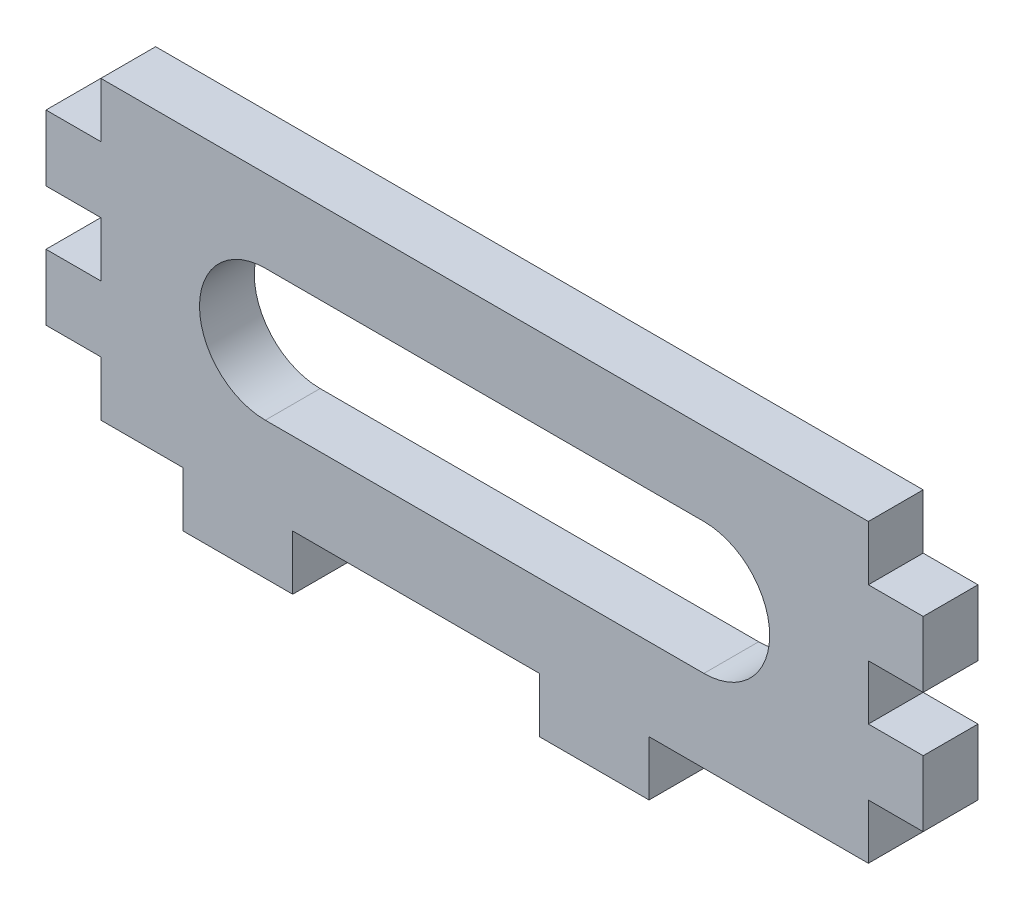
ISO-10303-21;
HEADER;
FILE_DESCRIPTION(('STEP AP214'),'2;1');
FILE_NAME('part.step','',(''),(''),'','','');
FILE_SCHEMA(('AUTOMOTIVE_DESIGN { 1 0 10303 214 1 1 1 1 }'));
ENDSEC;
DATA;
#1=APPLICATION_CONTEXT('core data for automotive mechanical design processes');
#2=APPLICATION_PROTOCOL_DEFINITION('international standard','automotive_design',2000,#1);
#3=PRODUCT_CONTEXT('',#1,'mechanical');
#4=PRODUCT('Part','Part','',(#3));
#5=PRODUCT_RELATED_PRODUCT_CATEGORY('part','',(#4));
#6=PRODUCT_DEFINITION_FORMATION('','',#4);
#7=PRODUCT_DEFINITION_CONTEXT('part definition',#1,'design');
#8=PRODUCT_DEFINITION('design','',#6,#7);
#9=PRODUCT_DEFINITION_SHAPE('','',#8);
#10=(LENGTH_UNIT() NAMED_UNIT(*) SI_UNIT(.MILLI.,.METRE.));
#11=(NAMED_UNIT(*) PLANE_ANGLE_UNIT() SI_UNIT($,.RADIAN.));
#12=(NAMED_UNIT(*) SI_UNIT($,.STERADIAN.) SOLID_ANGLE_UNIT());
#13=UNCERTAINTY_MEASURE_WITH_UNIT(LENGTH_MEASURE(1.E-05),#10,'distance_accuracy_value','');
#14=(GEOMETRIC_REPRESENTATION_CONTEXT(3) GLOBAL_UNCERTAINTY_ASSIGNED_CONTEXT((#13)) GLOBAL_UNIT_ASSIGNED_CONTEXT((#10,
#11,#12)) REPRESENTATION_CONTEXT('',''));
#15=CARTESIAN_POINT('',(0.,0.,0.));
#16=DIRECTION('',(0.,0.,1.));
#17=DIRECTION('',(1.,0.,0.));
#18=AXIS2_PLACEMENT_3D('',#15,#16,#17);
#19=CARTESIAN_POINT('',(121.174614020416,143.421111622309,-5.));
#20=DIRECTION('',(0.,-1.,0.));
#21=DIRECTION('',(0.,0.,-1.));
#22=AXIS2_PLACEMENT_3D('',#19,#20,#21);
#23=PLANE('',#22);
#24=DIRECTION('',(0.,0.,1.));
#25=VECTOR('',#24,1.);
#26=CARTESIAN_POINT('',(166.174614020416,143.421111622309,-5.));
#27=LINE('',#26,#25);
#28=CARTESIAN_POINT('',(166.174614020416,143.421111622309,-5.));
#29=VERTEX_POINT('',#28);
#30=CARTESIAN_POINT('',(166.174614020416,143.421111622309,0.));
#31=VERTEX_POINT('',#30);
#32=EDGE_CURVE('E268',#29,#31,#27,.T.);
#33=ORIENTED_EDGE('',*,*,#32,.T.);
#34=DIRECTION('',(1.,0.,0.));
#35=VECTOR('',#34,1.);
#36=CARTESIAN_POINT('',(121.174614020416,143.421111622309,0.));
#37=LINE('',#36,#35);
#38=CARTESIAN_POINT('',(143.674614020416,143.421111622309,0.));
#39=VERTEX_POINT('',#38);
#40=EDGE_CURVE('E316',#39,#31,#37,.T.);
#41=ORIENTED_EDGE('',*,*,#40,.F.);
#42=DIRECTION('',(0.,0.,1.));
#43=VECTOR('',#42,1.);
#44=CARTESIAN_POINT('',(143.674614020416,143.421111622309,-5.));
#45=LINE('',#44,#43);
#46=CARTESIAN_POINT('',(143.674614020416,143.421111622309,-5.));
#47=VERTEX_POINT('',#46);
#48=EDGE_CURVE('E298',#47,#39,#45,.T.);
#49=ORIENTED_EDGE('',*,*,#48,.F.);
#50=DIRECTION('',(1.,0.,0.));
#51=VECTOR('',#50,1.);
#52=CARTESIAN_POINT('',(121.174614020416,143.421111622309,-5.));
#53=LINE('',#52,#51);
#54=EDGE_CURVE('E484',#47,#29,#53,.T.);
#55=ORIENTED_EDGE('',*,*,#54,.T.);
#56=EDGE_LOOP('',(#33,#41,#49,#55));
#57=FACE_BOUND('',#56,.T.);
#58=ADVANCED_FACE('F33',(#57),#23,.T.);
#59=CARTESIAN_POINT('',(126.174614020416,143.421111622309,-5.));
#60=VERTEX_POINT('',#59);
#61=CARTESIAN_POINT('',(133.674614020416,143.421111622309,-5.));
#62=VERTEX_POINT('',#61);
#63=EDGE_CURVE('E485',#60,#62,#53,.T.);
#64=ORIENTED_EDGE('',*,*,#63,.T.);
#65=DIRECTION('',(0.,0.,1.));
#66=VECTOR('',#65,1.);
#67=CARTESIAN_POINT('',(133.674614020416,143.421111622309,-5.));
#68=LINE('',#67,#66);
#69=CARTESIAN_POINT('',(133.674614020416,143.421111622309,0.));
#70=VERTEX_POINT('',#69);
#71=EDGE_CURVE('E294',#62,#70,#68,.T.);
#72=ORIENTED_EDGE('',*,*,#71,.T.);
#73=CARTESIAN_POINT('',(126.174614020416,143.421111622309,0.));
#74=VERTEX_POINT('',#73);
#75=EDGE_CURVE('E328',#74,#70,#37,.T.);
#76=ORIENTED_EDGE('',*,*,#75,.F.);
#77=DIRECTION('',(0.,0.,1.));
#78=VECTOR('',#77,1.);
#79=CARTESIAN_POINT('',(126.174614020416,143.421111622309,-5.));
#80=LINE('',#79,#78);
#81=EDGE_CURVE('E424',#60,#74,#80,.T.);
#82=ORIENTED_EDGE('',*,*,#81,.F.);
#83=EDGE_LOOP('',(#64,#72,#76,#82));
#84=FACE_BOUND('',#83,.T.);
#85=ADVANCED_FACE('F526',(#84),#23,.T.);
#86=CARTESIAN_POINT('',(201.174614020416,170.421111622309,-5.));
#87=DIRECTION('',(1.,0.,0.));
#88=DIRECTION('',(0.,0.,-1.));
#89=AXIS2_PLACEMENT_3D('',#86,#87,#88);
#90=PLANE('',#89);
#91=DIRECTION('',(0.,0.,1.));
#92=VECTOR('',#91,1.);
#93=CARTESIAN_POINT('',(201.174614020416,165.421111622309,-5.));
#94=LINE('',#93,#92);
#95=CARTESIAN_POINT('',(201.174614020416,165.421111622309,-5.));
#96=VERTEX_POINT('',#95);
#97=CARTESIAN_POINT('',(201.174614020416,165.421111622309,0.));
#98=VERTEX_POINT('',#97);
#99=EDGE_CURVE('E359',#96,#98,#94,.T.);
#100=ORIENTED_EDGE('',*,*,#99,.T.);
#101=DIRECTION('',(0.,1.,0.));
#102=VECTOR('',#101,1.);
#103=CARTESIAN_POINT('',(201.174614020416,170.421111622309,0.));
#104=LINE('',#103,#102);
#105=CARTESIAN_POINT('',(201.174614020416,159.421111622309,0.));
#106=VERTEX_POINT('',#105);
#107=EDGE_CURVE('E330',#106,#98,#104,.T.);
#108=ORIENTED_EDGE('',*,*,#107,.F.);
#109=DIRECTION('',(0.,0.,1.));
#110=VECTOR('',#109,1.);
#111=CARTESIAN_POINT('',(201.174614020416,159.421111622309,-5.));
#112=LINE('',#111,#110);
#113=CARTESIAN_POINT('',(201.174614020416,159.421111622309,-5.));
#114=VERTEX_POINT('',#113);
#115=EDGE_CURVE('E357',#114,#106,#112,.T.);
#116=ORIENTED_EDGE('',*,*,#115,.F.);
#117=DIRECTION('',(0.,1.,0.));
#118=VECTOR('',#117,1.);
#119=CARTESIAN_POINT('',(201.174614020416,170.421111622309,-5.));
#120=LINE('',#119,#118);
#121=EDGE_CURVE('E360',#114,#96,#120,.T.);
#122=ORIENTED_EDGE('',*,*,#121,.T.);
#123=EDGE_LOOP('',(#100,#108,#116,#122));
#124=FACE_BOUND('',#123,.T.);
#125=ADVANCED_FACE('F355',(#124),#90,.T.);
#126=CARTESIAN_POINT('',(121.174614020416,170.421111622309,-5.));
#127=DIRECTION('',(-1.,0.,0.));
#128=DIRECTION('',(0.,0.,1.));
#129=AXIS2_PLACEMENT_3D('',#126,#127,#128);
#130=PLANE('',#129);
#131=DIRECTION('',(0.,0.,1.));
#132=VECTOR('',#131,1.);
#133=CARTESIAN_POINT('',(121.174614020416,159.421111622309,-5.));
#134=LINE('',#133,#132);
#135=CARTESIAN_POINT('',(121.174614020416,159.421111622309,-5.));
#136=VERTEX_POINT('',#135);
#137=CARTESIAN_POINT('',(121.174614020416,159.421111622309,0.));
#138=VERTEX_POINT('',#137);
#139=EDGE_CURVE('E452',#136,#138,#134,.T.);
#140=ORIENTED_EDGE('',*,*,#139,.T.);
#141=DIRECTION('',(0.,-1.,0.));
#142=VECTOR('',#141,1.);
#143=CARTESIAN_POINT('',(121.174614020416,170.421111622309,0.));
#144=LINE('',#143,#142);
#145=CARTESIAN_POINT('',(121.174614020416,165.421111622309,0.));
#146=VERTEX_POINT('',#145);
#147=EDGE_CURVE('E317',#146,#138,#144,.T.);
#148=ORIENTED_EDGE('',*,*,#147,.F.);
#149=DIRECTION('',(0.,0.,1.));
#150=VECTOR('',#149,1.);
#151=CARTESIAN_POINT('',(121.174614020416,165.421111622309,-5.));
#152=LINE('',#151,#150);
#153=CARTESIAN_POINT('',(121.174614020416,165.421111622309,-5.));
#154=VERTEX_POINT('',#153);
#155=EDGE_CURVE('E475',#154,#146,#152,.T.);
#156=ORIENTED_EDGE('',*,*,#155,.F.);
#157=DIRECTION('',(0.,-1.,0.));
#158=VECTOR('',#157,1.);
#159=CARTESIAN_POINT('',(121.174614020416,170.421111622309,-5.));
#160=LINE('',#159,#158);
#161=EDGE_CURVE('E338',#154,#136,#160,.T.);
#162=ORIENTED_EDGE('',*,*,#161,.T.);
#163=EDGE_LOOP('',(#140,#148,#156,#162));
#164=FACE_BOUND('',#163,.T.);
#165=ADVANCED_FACE('F548',(#164),#130,.T.);
#166=DIRECTION('',(0.,0.,1.));
#167=VECTOR('',#166,1.);
#168=CARTESIAN_POINT('',(121.174614020416,148.421111622309,-5.));
#169=LINE('',#168,#167);
#170=CARTESIAN_POINT('',(121.174614020416,148.421111622309,-5.));
#171=VERTEX_POINT('',#170);
#172=CARTESIAN_POINT('',(121.174614020416,148.421111622309,0.));
#173=VERTEX_POINT('',#172);
#174=EDGE_CURVE('E428',#171,#173,#169,.T.);
#175=ORIENTED_EDGE('',*,*,#174,.T.);
#176=CARTESIAN_POINT('',(121.174614020416,154.421111622309,0.));
#177=VERTEX_POINT('',#176);
#178=EDGE_CURVE('E474',#177,#173,#144,.T.);
#179=ORIENTED_EDGE('',*,*,#178,.F.);
#180=DIRECTION('',(0.,0.,1.));
#181=VECTOR('',#180,1.);
#182=CARTESIAN_POINT('',(121.174614020416,154.421111622309,-5.));
#183=LINE('',#182,#181);
#184=CARTESIAN_POINT('',(121.174614020416,154.421111622309,-5.));
#185=VERTEX_POINT('',#184);
#186=EDGE_CURVE('E445',#185,#177,#183,.T.);
#187=ORIENTED_EDGE('',*,*,#186,.F.);
#188=EDGE_CURVE('E332',#185,#171,#160,.T.);
#189=ORIENTED_EDGE('',*,*,#188,.T.);
#190=EDGE_LOOP('',(#175,#179,#187,#189));
#191=FACE_BOUND('',#190,.T.);
#192=ADVANCED_FACE('F35',(#191),#130,.T.);
#193=CARTESIAN_POINT('',(121.174614020416,170.421111622309,-5.));
#194=DIRECTION('',(0.,1.,0.));
#195=DIRECTION('',(0.,0.,1.));
#196=AXIS2_PLACEMENT_3D('',#193,#194,#195);
#197=PLANE('',#196);
#198=DIRECTION('',(0.,0.,1.));
#199=VECTOR('',#198,1.);
#200=CARTESIAN_POINT('',(196.174614020416,170.421111622309,-5.));
#201=LINE('',#200,#199);
#202=CARTESIAN_POINT('',(196.174614020416,170.421111622309,-5.));
#203=VERTEX_POINT('',#202);
#204=CARTESIAN_POINT('',(196.174614020416,170.421111622309,0.));
#205=VERTEX_POINT('',#204);
#206=EDGE_CURVE('E364',#203,#205,#201,.T.);
#207=ORIENTED_EDGE('',*,*,#206,.F.);
#208=DIRECTION('',(-1.,0.,0.));
#209=VECTOR('',#208,1.);
#210=CARTESIAN_POINT('',(121.174614020416,170.421111622309,-5.));
#211=LINE('',#210,#209);
#212=CARTESIAN_POINT('',(126.174614020416,170.421111622309,-5.));
#213=VERTEX_POINT('',#212);
#214=EDGE_CURVE('E11',#203,#213,#211,.T.);
#215=ORIENTED_EDGE('',*,*,#214,.T.);
#216=DIRECTION('',(0.,0.,1.));
#217=VECTOR('',#216,1.);
#218=CARTESIAN_POINT('',(126.174614020416,170.421111622309,-5.));
#219=LINE('',#218,#217);
#220=CARTESIAN_POINT('',(126.174614020416,170.421111622309,0.));
#221=VERTEX_POINT('',#220);
#222=EDGE_CURVE('E468',#213,#221,#219,.T.);
#223=ORIENTED_EDGE('',*,*,#222,.T.);
#224=DIRECTION('',(-1.,0.,0.));
#225=VECTOR('',#224,1.);
#226=CARTESIAN_POINT('',(121.174614020416,170.421111622309,0.));
#227=LINE('',#226,#225);
#228=EDGE_CURVE('E331',#205,#221,#227,.T.);
#229=ORIENTED_EDGE('',*,*,#228,.F.);
#230=EDGE_LOOP('',(#207,#215,#223,#229));
#231=FACE_BOUND('',#230,.T.);
#232=ADVANCED_FACE('F540',(#231),#197,.T.);
#233=DIRECTION('',(0.,0.,1.));
#234=VECTOR('',#233,1.);
#235=CARTESIAN_POINT('',(201.174614020416,154.421111622309,-5.));
#236=LINE('',#235,#234);
#237=CARTESIAN_POINT('',(201.174614020416,154.421111622309,-5.));
#238=VERTEX_POINT('',#237);
#239=CARTESIAN_POINT('',(201.174614020416,154.421111622309,0.));
#240=VERTEX_POINT('',#239);
#241=EDGE_CURVE('E391',#238,#240,#236,.T.);
#242=ORIENTED_EDGE('',*,*,#241,.T.);
#243=CARTESIAN_POINT('',(201.174614020416,148.421111622309,0.));
#244=VERTEX_POINT('',#243);
#245=EDGE_CURVE('E321',#244,#240,#104,.T.);
#246=ORIENTED_EDGE('',*,*,#245,.F.);
#247=DIRECTION('',(0.,0.,1.));
#248=VECTOR('',#247,1.);
#249=CARTESIAN_POINT('',(201.174614020416,148.421111622309,-5.));
#250=LINE('',#249,#248);
#251=CARTESIAN_POINT('',(201.174614020416,148.421111622309,-5.));
#252=VERTEX_POINT('',#251);
#253=EDGE_CURVE('E409',#252,#244,#250,.T.);
#254=ORIENTED_EDGE('',*,*,#253,.F.);
#255=EDGE_CURVE('E43',#252,#238,#120,.T.);
#256=ORIENTED_EDGE('',*,*,#255,.T.);
#257=EDGE_LOOP('',(#242,#246,#254,#256));
#258=FACE_BOUND('',#257,.T.);
#259=ADVANCED_FACE('F507',(#258),#90,.T.);
#260=DIRECTION('',(0.,0.,1.));
#261=VECTOR('',#260,1.);
#262=CARTESIAN_POINT('',(176.174614020416,143.421111622309,-5.));
#263=LINE('',#262,#261);
#264=CARTESIAN_POINT('',(176.174614020416,143.421111622309,-5.));
#265=VERTEX_POINT('',#264);
#266=CARTESIAN_POINT('',(176.174614020416,143.421111622309,0.));
#267=VERTEX_POINT('',#266);
#268=EDGE_CURVE('E277',#265,#267,#263,.T.);
#269=ORIENTED_EDGE('',*,*,#268,.F.);
#270=CARTESIAN_POINT('',(196.174614020416,143.421111622309,-5.));
#271=VERTEX_POINT('',#270);
#272=EDGE_CURVE('E37',#265,#271,#53,.T.);
#273=ORIENTED_EDGE('',*,*,#272,.T.);
#274=DIRECTION('',(0.,0.,1.));
#275=VECTOR('',#274,1.);
#276=CARTESIAN_POINT('',(196.174614020416,143.421111622309,-5.));
#277=LINE('',#276,#275);
#278=CARTESIAN_POINT('',(196.174614020416,143.421111622309,0.));
#279=VERTEX_POINT('',#278);
#280=EDGE_CURVE('E412',#271,#279,#277,.T.);
#281=ORIENTED_EDGE('',*,*,#280,.T.);
#282=EDGE_CURVE('E314',#267,#279,#37,.T.);
#283=ORIENTED_EDGE('',*,*,#282,.F.);
#284=EDGE_LOOP('',(#269,#273,#281,#283));
#285=FACE_BOUND('',#284,.T.);
#286=ADVANCED_FACE('F495',(#285),#23,.T.);
#287=CARTESIAN_POINT('',(0.,0.,-5.));
#288=DIRECTION('',(0.,0.,1.));
#289=DIRECTION('',(1.,0.,0.));
#290=AXIS2_PLACEMENT_3D('',#287,#288,#289);
#291=PLANE('',#290);
#292=DIRECTION('',(-1.,0.,0.));
#293=VECTOR('',#292,1.);
#294=CARTESIAN_POINT('',(141.174614020416,162.921111622309,-5.));
#295=LINE('',#294,#293);
#296=CARTESIAN_POINT('',(181.174614020416,162.921111622309,-5.));
#297=VERTEX_POINT('',#296);
#298=CARTESIAN_POINT('',(141.174614020416,162.921111622309,-5.));
#299=VERTEX_POINT('',#298);
#300=EDGE_CURVE('E603',#297,#299,#295,.T.);
#301=ORIENTED_EDGE('',*,*,#300,.T.);
#302=CARTESIAN_POINT('',(141.174614020416,156.921111622309,-5.));
#303=DIRECTION('',(0.,0.,1.));
#304=DIRECTION('',(1.,0.,0.));
#305=AXIS2_PLACEMENT_3D('',#302,#303,#304);
#306=CIRCLE('',#305,6.00000000000001);
#307=CARTESIAN_POINT('',(141.174614020416,150.921111622309,-5.));
#308=VERTEX_POINT('',#307);
#309=EDGE_CURVE('E593',#299,#308,#306,.T.);
#310=ORIENTED_EDGE('',*,*,#309,.T.);
#311=DIRECTION('',(1.,0.,0.));
#312=VECTOR('',#311,1.);
#313=CARTESIAN_POINT('',(141.174614020416,150.921111622309,-5.));
#314=LINE('',#313,#312);
#315=CARTESIAN_POINT('',(181.174614020416,150.921111622309,-5.));
#316=VERTEX_POINT('',#315);
#317=EDGE_CURVE('E596',#308,#316,#314,.T.);
#318=ORIENTED_EDGE('',*,*,#317,.T.);
#319=CARTESIAN_POINT('',(181.174614020416,156.921111622309,-5.));
#320=DIRECTION('',(0.,0.,1.));
#321=DIRECTION('',(1.,0.,0.));
#322=AXIS2_PLACEMENT_3D('',#319,#320,#321);
#323=CIRCLE('',#322,6.00000000000001);
#324=EDGE_CURVE('E600',#316,#297,#323,.T.);
#325=ORIENTED_EDGE('',*,*,#324,.T.);
#326=EDGE_LOOP('',(#301,#310,#318,#325));
#327=FACE_BOUND('',#326,.T.);
#328=DIRECTION('',(0.,-1.,0.));
#329=VECTOR('',#328,1.);
#330=CARTESIAN_POINT('',(196.174614020416,165.421111622309,-5.));
#331=LINE('',#330,#329);
#332=CARTESIAN_POINT('',(196.174614020416,165.421111622309,-5.));
#333=VERTEX_POINT('',#332);
#334=EDGE_CURVE('E365',#203,#333,#331,.T.);
#335=ORIENTED_EDGE('',*,*,#334,.T.);
#336=DIRECTION('',(1.,0.,0.));
#337=VECTOR('',#336,1.);
#338=CARTESIAN_POINT('',(196.174614020416,165.421111622309,-5.));
#339=LINE('',#338,#337);
#340=EDGE_CURVE('E369',#333,#96,#339,.T.);
#341=ORIENTED_EDGE('',*,*,#340,.T.);
#342=ORIENTED_EDGE('',*,*,#121,.F.);
#343=DIRECTION('',(-1.,0.,0.));
#344=VECTOR('',#343,1.);
#345=CARTESIAN_POINT('',(201.174614020416,159.421111622309,-5.));
#346=LINE('',#345,#344);
#347=CARTESIAN_POINT('',(196.174614020416,159.421111622309,-5.));
#348=VERTEX_POINT('',#347);
#349=EDGE_CURVE('E373',#114,#348,#346,.T.);
#350=ORIENTED_EDGE('',*,*,#349,.T.);
#351=DIRECTION('',(0.,-1.,0.));
#352=VECTOR('',#351,1.);
#353=CARTESIAN_POINT('',(196.174614020416,159.421111622309,-5.));
#354=LINE('',#353,#352);
#355=CARTESIAN_POINT('',(196.174614020416,154.421111622309,-5.));
#356=VERTEX_POINT('',#355);
#357=EDGE_CURVE('E376',#348,#356,#354,.T.);
#358=ORIENTED_EDGE('',*,*,#357,.T.);
#359=DIRECTION('',(1.,0.,0.));
#360=VECTOR('',#359,1.);
#361=CARTESIAN_POINT('',(201.174614020416,154.421111622309,-5.));
#362=LINE('',#361,#360);
#363=EDGE_CURVE('E380',#356,#238,#362,.T.);
#364=ORIENTED_EDGE('',*,*,#363,.T.);
#365=ORIENTED_EDGE('',*,*,#255,.F.);
#366=DIRECTION('',(-1.,0.,0.));
#367=VECTOR('',#366,1.);
#368=CARTESIAN_POINT('',(201.174614020416,148.421111622309,-5.));
#369=LINE('',#368,#367);
#370=CARTESIAN_POINT('',(196.174614020416,148.421111622309,-5.));
#371=VERTEX_POINT('',#370);
#372=EDGE_CURVE('E398',#252,#371,#369,.T.);
#373=ORIENTED_EDGE('',*,*,#372,.T.);
#374=DIRECTION('',(0.,-1.,0.));
#375=VECTOR('',#374,1.);
#376=CARTESIAN_POINT('',(196.174614020416,148.421111622309,-5.));
#377=LINE('',#376,#375);
#378=EDGE_CURVE('E401',#371,#271,#377,.T.);
#379=ORIENTED_EDGE('',*,*,#378,.T.);
#380=ORIENTED_EDGE('',*,*,#272,.F.);
#381=DIRECTION('',(0.,1.,0.));
#382=VECTOR('',#381,1.);
#383=CARTESIAN_POINT('',(176.174614020416,143.421111622309,-5.));
#384=LINE('',#383,#382);
#385=CARTESIAN_POINT('',(176.174614020416,138.421111622309,-5.));
#386=VERTEX_POINT('',#385);
#387=EDGE_CURVE('E254',#386,#265,#384,.T.);
#388=ORIENTED_EDGE('',*,*,#387,.F.);
#389=DIRECTION('',(1.,0.,0.));
#390=VECTOR('',#389,1.);
#391=CARTESIAN_POINT('',(166.174614020416,138.421111622309,-5.));
#392=LINE('',#391,#390);
#393=CARTESIAN_POINT('',(166.174614020416,138.421111622309,-5.));
#394=VERTEX_POINT('',#393);
#395=EDGE_CURVE('E248',#394,#386,#392,.T.);
#396=ORIENTED_EDGE('',*,*,#395,.F.);
#397=DIRECTION('',(0.,-1.,0.));
#398=VECTOR('',#397,1.);
#399=CARTESIAN_POINT('',(166.174614020416,143.421111622309,-5.));
#400=LINE('',#399,#398);
#401=EDGE_CURVE('E262',#29,#394,#400,.T.);
#402=ORIENTED_EDGE('',*,*,#401,.F.);
#403=ORIENTED_EDGE('',*,*,#54,.F.);
#404=DIRECTION('',(0.,1.,0.));
#405=VECTOR('',#404,1.);
#406=CARTESIAN_POINT('',(143.674614020416,143.421111622309,-5.));
#407=LINE('',#406,#405);
#408=CARTESIAN_POINT('',(143.674614020416,138.421111622309,-5.));
#409=VERTEX_POINT('',#408);
#410=EDGE_CURVE('E283',#409,#47,#407,.T.);
#411=ORIENTED_EDGE('',*,*,#410,.F.);
#412=DIRECTION('',(1.,0.,0.));
#413=VECTOR('',#412,1.);
#414=CARTESIAN_POINT('',(133.674614020416,138.421111622309,-5.));
#415=LINE('',#414,#413);
#416=CARTESIAN_POINT('',(133.674614020416,138.421111622309,-5.));
#417=VERTEX_POINT('',#416);
#418=EDGE_CURVE('E280',#417,#409,#415,.T.);
#419=ORIENTED_EDGE('',*,*,#418,.F.);
#420=DIRECTION('',(0.,-1.,0.));
#421=VECTOR('',#420,1.);
#422=CARTESIAN_POINT('',(133.674614020416,143.421111622309,-5.));
#423=LINE('',#422,#421);
#424=EDGE_CURVE('E284',#62,#417,#423,.T.);
#425=ORIENTED_EDGE('',*,*,#424,.F.);
#426=ORIENTED_EDGE('',*,*,#63,.F.);
#427=DIRECTION('',(0.,1.,0.));
#428=VECTOR('',#427,1.);
#429=CARTESIAN_POINT('',(126.174614020416,148.421111622309,-5.));
#430=LINE('',#429,#428);
#431=CARTESIAN_POINT('',(126.174614020416,148.421111622309,-5.));
#432=VERTEX_POINT('',#431);
#433=EDGE_CURVE('E417',#60,#432,#430,.T.);
#434=ORIENTED_EDGE('',*,*,#433,.T.);
#435=DIRECTION('',(-1.,0.,0.));
#436=VECTOR('',#435,1.);
#437=CARTESIAN_POINT('',(121.174614020416,148.421111622309,-5.));
#438=LINE('',#437,#436);
#439=EDGE_CURVE('E420',#432,#171,#438,.T.);
#440=ORIENTED_EDGE('',*,*,#439,.T.);
#441=ORIENTED_EDGE('',*,*,#188,.F.);
#442=DIRECTION('',(1.,0.,0.));
#443=VECTOR('',#442,1.);
#444=CARTESIAN_POINT('',(121.174614020416,154.421111622309,-5.));
#445=LINE('',#444,#443);
#446=CARTESIAN_POINT('',(126.174614020416,154.421111622309,-5.));
#447=VERTEX_POINT('',#446);
#448=EDGE_CURVE('E435',#185,#447,#445,.T.);
#449=ORIENTED_EDGE('',*,*,#448,.T.);
#450=DIRECTION('',(0.,1.,0.));
#451=VECTOR('',#450,1.);
#452=CARTESIAN_POINT('',(126.174614020416,159.421111622309,-5.));
#453=LINE('',#452,#451);
#454=CARTESIAN_POINT('',(126.174614020416,159.421111622309,-5.));
#455=VERTEX_POINT('',#454);
#456=EDGE_CURVE('E438',#447,#455,#453,.T.);
#457=ORIENTED_EDGE('',*,*,#456,.T.);
#458=DIRECTION('',(-1.,0.,0.));
#459=VECTOR('',#458,1.);
#460=CARTESIAN_POINT('',(121.174614020416,159.421111622309,-5.));
#461=LINE('',#460,#459);
#462=EDGE_CURVE('E442',#455,#136,#461,.T.);
#463=ORIENTED_EDGE('',*,*,#462,.T.);
#464=ORIENTED_EDGE('',*,*,#161,.F.);
#465=DIRECTION('',(1.,0.,0.));
#466=VECTOR('',#465,1.);
#467=CARTESIAN_POINT('',(126.174614020416,165.421111622309,-5.));
#468=LINE('',#467,#466);
#469=CARTESIAN_POINT('',(126.174614020416,165.421111622309,-5.));
#470=VERTEX_POINT('',#469);
#471=EDGE_CURVE('E464',#154,#470,#468,.T.);
#472=ORIENTED_EDGE('',*,*,#471,.T.);
#473=DIRECTION('',(0.,1.,0.));
#474=VECTOR('',#473,1.);
#475=CARTESIAN_POINT('',(126.174614020416,165.421111622309,-5.));
#476=LINE('',#475,#474);
#477=EDGE_CURVE('E461',#470,#213,#476,.T.);
#478=ORIENTED_EDGE('',*,*,#477,.T.);
#479=ORIENTED_EDGE('',*,*,#214,.F.);
#480=EDGE_LOOP('',(#335,#341,#342,#350,#358,#364,#365,#373,#379,#380,#388,#396,#402,#403,#411,
#419,#425,#426,#434,#440,#441,#449,#457,#463,#464,#472,#478,#479));
#481=FACE_BOUND('',#480,.T.);
#482=ADVANCED_FACE('F260',(#327,#481),#291,.F.);
#483=CARTESIAN_POINT('',(0.,0.,0.));
#484=DIRECTION('',(0.,0.,1.));
#485=DIRECTION('',(1.,0.,0.));
#486=AXIS2_PLACEMENT_3D('',#483,#484,#485);
#487=PLANE('',#486);
#488=CARTESIAN_POINT('',(141.174614020416,156.921111622309,0.));
#489=DIRECTION('',(0.,0.,1.));
#490=DIRECTION('',(1.,0.,0.));
#491=AXIS2_PLACEMENT_3D('',#488,#489,#490);
#492=CIRCLE('',#491,6.00000000000001);
#493=CARTESIAN_POINT('',(141.174614020416,162.921111622309,0.));
#494=VERTEX_POINT('',#493);
#495=CARTESIAN_POINT('',(141.174614020416,150.921111622309,0.));
#496=VERTEX_POINT('',#495);
#497=EDGE_CURVE('E297',#494,#496,#492,.T.);
#498=ORIENTED_EDGE('',*,*,#497,.F.);
#499=DIRECTION('',(-1.,0.,0.));
#500=VECTOR('',#499,1.);
#501=CARTESIAN_POINT('',(141.174614020416,162.921111622309,0.));
#502=LINE('',#501,#500);
#503=CARTESIAN_POINT('',(181.174614020416,162.921111622309,0.));
#504=VERTEX_POINT('',#503);
#505=EDGE_CURVE('E597',#504,#494,#502,.T.);
#506=ORIENTED_EDGE('',*,*,#505,.F.);
#507=CARTESIAN_POINT('',(181.174614020416,156.921111622309,0.));
#508=DIRECTION('',(0.,0.,1.));
#509=DIRECTION('',(1.,0.,0.));
#510=AXIS2_PLACEMENT_3D('',#507,#508,#509);
#511=CIRCLE('',#510,6.00000000000001);
#512=CARTESIAN_POINT('',(181.174614020416,150.921111622309,0.));
#513=VERTEX_POINT('',#512);
#514=EDGE_CURVE('E611',#513,#504,#511,.T.);
#515=ORIENTED_EDGE('',*,*,#514,.F.);
#516=DIRECTION('',(1.,0.,0.));
#517=VECTOR('',#516,1.);
#518=CARTESIAN_POINT('',(141.174614020416,150.921111622309,0.));
#519=LINE('',#518,#517);
#520=EDGE_CURVE('E608',#496,#513,#519,.T.);
#521=ORIENTED_EDGE('',*,*,#520,.F.);
#522=EDGE_LOOP('',(#498,#506,#515,#521));
#523=FACE_BOUND('',#522,.T.);
#524=DIRECTION('',(1.,0.,0.));
#525=VECTOR('',#524,1.);
#526=CARTESIAN_POINT('',(196.174614020416,165.421111622309,0.));
#527=LINE('',#526,#525);
#528=CARTESIAN_POINT('',(196.174614020416,165.421111622309,0.));
#529=VERTEX_POINT('',#528);
#530=EDGE_CURVE('E349',#529,#98,#527,.T.);
#531=ORIENTED_EDGE('',*,*,#530,.F.);
#532=DIRECTION('',(0.,-1.,0.));
#533=VECTOR('',#532,1.);
#534=CARTESIAN_POINT('',(196.174614020416,165.421111622309,0.));
#535=LINE('',#534,#533);
#536=EDGE_CURVE('E624',#205,#529,#535,.T.);
#537=ORIENTED_EDGE('',*,*,#536,.F.);
#538=ORIENTED_EDGE('',*,*,#228,.T.);
#539=DIRECTION('',(0.,1.,0.));
#540=VECTOR('',#539,1.);
#541=CARTESIAN_POINT('',(126.174614020416,165.421111622309,0.));
#542=LINE('',#541,#540);
#543=CARTESIAN_POINT('',(126.174614020416,165.421111622309,0.));
#544=VERTEX_POINT('',#543);
#545=EDGE_CURVE('E455',#544,#221,#542,.T.);
#546=ORIENTED_EDGE('',*,*,#545,.F.);
#547=DIRECTION('',(1.,0.,0.));
#548=VECTOR('',#547,1.);
#549=CARTESIAN_POINT('',(126.174614020416,165.421111622309,0.));
#550=LINE('',#549,#548);
#551=EDGE_CURVE('E465',#146,#544,#550,.T.);
#552=ORIENTED_EDGE('',*,*,#551,.F.);
#553=ORIENTED_EDGE('',*,*,#147,.T.);
#554=DIRECTION('',(-1.,0.,0.));
#555=VECTOR('',#554,1.);
#556=CARTESIAN_POINT('',(121.174614020416,159.421111622309,0.));
#557=LINE('',#556,#555);
#558=CARTESIAN_POINT('',(126.174614020416,159.421111622309,0.));
#559=VERTEX_POINT('',#558);
#560=EDGE_CURVE('E439',#559,#138,#557,.T.);
#561=ORIENTED_EDGE('',*,*,#560,.F.);
#562=DIRECTION('',(0.,1.,0.));
#563=VECTOR('',#562,1.);
#564=CARTESIAN_POINT('',(126.174614020416,159.421111622309,0.));
#565=LINE('',#564,#563);
#566=CARTESIAN_POINT('',(126.174614020416,154.421111622309,0.));
#567=VERTEX_POINT('',#566);
#568=EDGE_CURVE('E448',#567,#559,#565,.T.);
#569=ORIENTED_EDGE('',*,*,#568,.F.);
#570=DIRECTION('',(1.,0.,0.));
#571=VECTOR('',#570,1.);
#572=CARTESIAN_POINT('',(121.174614020416,154.421111622309,0.));
#573=LINE('',#572,#571);
#574=EDGE_CURVE('E431',#177,#567,#573,.T.);
#575=ORIENTED_EDGE('',*,*,#574,.F.);
#576=ORIENTED_EDGE('',*,*,#178,.T.);
#577=DIRECTION('',(-1.,0.,0.));
#578=VECTOR('',#577,1.);
#579=CARTESIAN_POINT('',(121.174614020416,148.421111622309,0.));
#580=LINE('',#579,#578);
#581=CARTESIAN_POINT('',(126.174614020416,148.421111622309,0.));
#582=VERTEX_POINT('',#581);
#583=EDGE_CURVE('E421',#582,#173,#580,.T.);
#584=ORIENTED_EDGE('',*,*,#583,.F.);
#585=DIRECTION('',(0.,1.,0.));
#586=VECTOR('',#585,1.);
#587=CARTESIAN_POINT('',(126.174614020416,148.421111622309,0.));
#588=LINE('',#587,#586);
#589=EDGE_CURVE('E411',#74,#582,#588,.T.);
#590=ORIENTED_EDGE('',*,*,#589,.F.);
#591=ORIENTED_EDGE('',*,*,#75,.T.);
#592=DIRECTION('',(0.,-1.,0.));
#593=VECTOR('',#592,1.);
#594=CARTESIAN_POINT('',(133.674614020416,143.421111622309,0.));
#595=LINE('',#594,#593);
#596=CARTESIAN_POINT('',(133.674614020416,138.421111622309,0.));
#597=VERTEX_POINT('',#596);
#598=EDGE_CURVE('E59',#70,#597,#595,.T.);
#599=ORIENTED_EDGE('',*,*,#598,.T.);
#600=DIRECTION('',(1.,0.,0.));
#601=VECTOR('',#600,1.);
#602=CARTESIAN_POINT('',(133.674614020416,138.421111622309,0.));
#603=LINE('',#602,#601);
#604=CARTESIAN_POINT('',(143.674614020416,138.421111622309,0.));
#605=VERTEX_POINT('',#604);
#606=EDGE_CURVE('E285',#597,#605,#603,.T.);
#607=ORIENTED_EDGE('',*,*,#606,.T.);
#608=DIRECTION('',(0.,1.,0.));
#609=VECTOR('',#608,1.);
#610=CARTESIAN_POINT('',(143.674614020416,143.421111622309,0.));
#611=LINE('',#610,#609);
#612=EDGE_CURVE('E288',#605,#39,#611,.T.);
#613=ORIENTED_EDGE('',*,*,#612,.T.);
#614=ORIENTED_EDGE('',*,*,#40,.T.);
#615=DIRECTION('',(0.,-1.,0.));
#616=VECTOR('',#615,1.);
#617=CARTESIAN_POINT('',(166.174614020416,143.421111622309,0.));
#618=LINE('',#617,#616);
#619=CARTESIAN_POINT('',(166.174614020416,138.421111622309,0.));
#620=VERTEX_POINT('',#619);
#621=EDGE_CURVE('E273',#31,#620,#618,.T.);
#622=ORIENTED_EDGE('',*,*,#621,.T.);
#623=DIRECTION('',(1.,0.,0.));
#624=VECTOR('',#623,1.);
#625=CARTESIAN_POINT('',(166.174614020416,138.421111622309,0.));
#626=LINE('',#625,#624);
#627=CARTESIAN_POINT('',(176.174614020416,138.421111622309,0.));
#628=VERTEX_POINT('',#627);
#629=EDGE_CURVE('E249',#620,#628,#626,.T.);
#630=ORIENTED_EDGE('',*,*,#629,.T.);
#631=DIRECTION('',(0.,1.,0.));
#632=VECTOR('',#631,1.);
#633=CARTESIAN_POINT('',(176.174614020416,143.421111622309,0.));
#634=LINE('',#633,#632);
#635=EDGE_CURVE('E51',#628,#267,#634,.T.);
#636=ORIENTED_EDGE('',*,*,#635,.T.);
#637=ORIENTED_EDGE('',*,*,#282,.T.);
#638=DIRECTION('',(0.,-1.,0.));
#639=VECTOR('',#638,1.);
#640=CARTESIAN_POINT('',(196.174614020416,148.421111622309,0.));
#641=LINE('',#640,#639);
#642=CARTESIAN_POINT('',(196.174614020416,148.421111622309,0.));
#643=VERTEX_POINT('',#642);
#644=EDGE_CURVE('E402',#643,#279,#641,.T.);
#645=ORIENTED_EDGE('',*,*,#644,.F.);
#646=DIRECTION('',(-1.,0.,0.));
#647=VECTOR('',#646,1.);
#648=CARTESIAN_POINT('',(201.174614020416,148.421111622309,0.));
#649=LINE('',#648,#647);
#650=EDGE_CURVE('E390',#244,#643,#649,.T.);
#651=ORIENTED_EDGE('',*,*,#650,.F.);
#652=ORIENTED_EDGE('',*,*,#245,.T.);
#653=DIRECTION('',(1.,0.,0.));
#654=VECTOR('',#653,1.);
#655=CARTESIAN_POINT('',(201.174614020416,154.421111622309,0.));
#656=LINE('',#655,#654);
#657=CARTESIAN_POINT('',(196.174614020416,154.421111622309,0.));
#658=VERTEX_POINT('',#657);
#659=EDGE_CURVE('E377',#658,#240,#656,.T.);
#660=ORIENTED_EDGE('',*,*,#659,.F.);
#661=DIRECTION('',(0.,-1.,0.));
#662=VECTOR('',#661,1.);
#663=CARTESIAN_POINT('',(196.174614020416,159.421111622309,0.));
#664=LINE('',#663,#662);
#665=CARTESIAN_POINT('',(196.174614020416,159.421111622309,0.));
#666=VERTEX_POINT('',#665);
#667=EDGE_CURVE('E385',#666,#658,#664,.T.);
#668=ORIENTED_EDGE('',*,*,#667,.F.);
#669=DIRECTION('',(-1.,0.,0.));
#670=VECTOR('',#669,1.);
#671=CARTESIAN_POINT('',(201.174614020416,159.421111622309,0.));
#672=LINE('',#671,#670);
#673=EDGE_CURVE('E351',#106,#666,#672,.T.);
#674=ORIENTED_EDGE('',*,*,#673,.F.);
#675=ORIENTED_EDGE('',*,*,#107,.T.);
#676=EDGE_LOOP('',(#531,#537,#538,#546,#552,#553,#561,#569,#575,#576,#584,#590,#591,#599,#607,
#613,#614,#622,#630,#636,#637,#645,#651,#652,#660,#668,#674,#675));
#677=FACE_BOUND('',#676,.T.);
#678=ADVANCED_FACE('F348',(#523,#677),#487,.T.);
#679=CARTESIAN_POINT('',(126.174614020416,165.421111622309,-5.));
#680=DIRECTION('',(1.,0.,0.));
#681=DIRECTION('',(0.,0.,-1.));
#682=AXIS2_PLACEMENT_3D('',#679,#680,#681);
#683=PLANE('',#682);
#684=ORIENTED_EDGE('',*,*,#545,.T.);
#685=ORIENTED_EDGE('',*,*,#222,.F.);
#686=ORIENTED_EDGE('',*,*,#477,.F.);
#687=DIRECTION('',(0.,0.,1.));
#688=VECTOR('',#687,1.);
#689=CARTESIAN_POINT('',(126.174614020416,165.421111622309,-5.));
#690=LINE('',#689,#688);
#691=EDGE_CURVE('E472',#470,#544,#690,.T.);
#692=ORIENTED_EDGE('',*,*,#691,.T.);
#693=EDGE_LOOP('',(#684,#685,#686,#692));
#694=FACE_BOUND('',#693,.T.);
#695=ADVANCED_FACE('F636',(#694),#683,.F.);
#696=CARTESIAN_POINT('',(126.174614020416,165.421111622309,-5.));
#697=DIRECTION('',(0.,-1.,0.));
#698=DIRECTION('',(0.,0.,-1.));
#699=AXIS2_PLACEMENT_3D('',#696,#697,#698);
#700=PLANE('',#699);
#701=ORIENTED_EDGE('',*,*,#551,.T.);
#702=ORIENTED_EDGE('',*,*,#691,.F.);
#703=ORIENTED_EDGE('',*,*,#471,.F.);
#704=ORIENTED_EDGE('',*,*,#155,.T.);
#705=EDGE_LOOP('',(#701,#702,#703,#704));
#706=FACE_BOUND('',#705,.T.);
#707=ADVANCED_FACE('F638',(#706),#700,.F.);
#708=CARTESIAN_POINT('',(121.174614020416,159.421111622309,-5.));
#709=DIRECTION('',(0.,1.,0.));
#710=DIRECTION('',(0.,0.,1.));
#711=AXIS2_PLACEMENT_3D('',#708,#709,#710);
#712=PLANE('',#711);
#713=ORIENTED_EDGE('',*,*,#560,.T.);
#714=ORIENTED_EDGE('',*,*,#139,.F.);
#715=ORIENTED_EDGE('',*,*,#462,.F.);
#716=DIRECTION('',(0.,0.,1.));
#717=VECTOR('',#716,1.);
#718=CARTESIAN_POINT('',(126.174614020416,159.421111622309,-5.));
#719=LINE('',#718,#717);
#720=EDGE_CURVE('E456',#455,#559,#719,.T.);
#721=ORIENTED_EDGE('',*,*,#720,.T.);
#722=EDGE_LOOP('',(#713,#714,#715,#721));
#723=FACE_BOUND('',#722,.T.);
#724=ADVANCED_FACE('F640',(#723),#712,.F.);
#725=CARTESIAN_POINT('',(126.174614020416,159.421111622309,-5.));
#726=DIRECTION('',(1.,0.,0.));
#727=DIRECTION('',(0.,0.,-1.));
#728=AXIS2_PLACEMENT_3D('',#725,#726,#727);
#729=PLANE('',#728);
#730=ORIENTED_EDGE('',*,*,#568,.T.);
#731=ORIENTED_EDGE('',*,*,#720,.F.);
#732=ORIENTED_EDGE('',*,*,#456,.F.);
#733=DIRECTION('',(0.,0.,1.));
#734=VECTOR('',#733,1.);
#735=CARTESIAN_POINT('',(126.174614020416,154.421111622309,-5.));
#736=LINE('',#735,#734);
#737=EDGE_CURVE('E458',#447,#567,#736,.T.);
#738=ORIENTED_EDGE('',*,*,#737,.T.);
#739=EDGE_LOOP('',(#730,#731,#732,#738));
#740=FACE_BOUND('',#739,.T.);
#741=ADVANCED_FACE('F646',(#740),#729,.F.);
#742=CARTESIAN_POINT('',(121.174614020416,154.421111622309,-5.));
#743=DIRECTION('',(0.,-1.,0.));
#744=DIRECTION('',(0.,0.,-1.));
#745=AXIS2_PLACEMENT_3D('',#742,#743,#744);
#746=PLANE('',#745);
#747=ORIENTED_EDGE('',*,*,#574,.T.);
#748=ORIENTED_EDGE('',*,*,#737,.F.);
#749=ORIENTED_EDGE('',*,*,#448,.F.);
#750=ORIENTED_EDGE('',*,*,#186,.T.);
#751=EDGE_LOOP('',(#747,#748,#749,#750));
#752=FACE_BOUND('',#751,.T.);
#753=ADVANCED_FACE('F650',(#752),#746,.F.);
#754=CARTESIAN_POINT('',(121.174614020416,148.421111622309,-5.));
#755=DIRECTION('',(0.,1.,0.));
#756=DIRECTION('',(0.,0.,1.));
#757=AXIS2_PLACEMENT_3D('',#754,#755,#756);
#758=PLANE('',#757);
#759=ORIENTED_EDGE('',*,*,#583,.T.);
#760=ORIENTED_EDGE('',*,*,#174,.F.);
#761=ORIENTED_EDGE('',*,*,#439,.F.);
#762=DIRECTION('',(0.,0.,1.));
#763=VECTOR('',#762,1.);
#764=CARTESIAN_POINT('',(126.174614020416,148.421111622309,-5.));
#765=LINE('',#764,#763);
#766=EDGE_CURVE('E432',#432,#582,#765,.T.);
#767=ORIENTED_EDGE('',*,*,#766,.T.);
#768=EDGE_LOOP('',(#759,#760,#761,#767));
#769=FACE_BOUND('',#768,.T.);
#770=ADVANCED_FACE('F575',(#769),#758,.F.);
#771=CARTESIAN_POINT('',(126.174614020416,148.421111622309,-5.));
#772=DIRECTION('',(1.,0.,0.));
#773=DIRECTION('',(0.,0.,-1.));
#774=AXIS2_PLACEMENT_3D('',#771,#772,#773);
#775=PLANE('',#774);
#776=ORIENTED_EDGE('',*,*,#589,.T.);
#777=ORIENTED_EDGE('',*,*,#766,.F.);
#778=ORIENTED_EDGE('',*,*,#433,.F.);
#779=ORIENTED_EDGE('',*,*,#81,.T.);
#780=EDGE_LOOP('',(#776,#777,#778,#779));
#781=FACE_BOUND('',#780,.T.);
#782=ADVANCED_FACE('F578',(#781),#775,.F.);
#783=CARTESIAN_POINT('',(201.174614020416,148.421111622309,-5.));
#784=DIRECTION('',(0.,1.,0.));
#785=DIRECTION('',(0.,0.,1.));
#786=AXIS2_PLACEMENT_3D('',#783,#784,#785);
#787=PLANE('',#786);
#788=ORIENTED_EDGE('',*,*,#650,.T.);
#789=DIRECTION('',(0.,0.,1.));
#790=VECTOR('',#789,1.);
#791=CARTESIAN_POINT('',(196.174614020416,148.421111622309,-5.));
#792=LINE('',#791,#790);
#793=EDGE_CURVE('E405',#371,#643,#792,.T.);
#794=ORIENTED_EDGE('',*,*,#793,.F.);
#795=ORIENTED_EDGE('',*,*,#372,.F.);
#796=ORIENTED_EDGE('',*,*,#253,.T.);
#797=EDGE_LOOP('',(#788,#794,#795,#796));
#798=FACE_BOUND('',#797,.T.);
#799=ADVANCED_FACE('F505',(#798),#787,.F.);
#800=CARTESIAN_POINT('',(196.174614020416,148.421111622309,-5.));
#801=DIRECTION('',(-1.,0.,0.));
#802=DIRECTION('',(0.,0.,1.));
#803=AXIS2_PLACEMENT_3D('',#800,#801,#802);
#804=PLANE('',#803);
#805=ORIENTED_EDGE('',*,*,#644,.T.);
#806=ORIENTED_EDGE('',*,*,#280,.F.);
#807=ORIENTED_EDGE('',*,*,#378,.F.);
#808=ORIENTED_EDGE('',*,*,#793,.T.);
#809=EDGE_LOOP('',(#805,#806,#807,#808));
#810=FACE_BOUND('',#809,.T.);
#811=ADVANCED_FACE('F499',(#810),#804,.F.);
#812=CARTESIAN_POINT('',(201.174614020416,159.421111622309,-5.));
#813=DIRECTION('',(0.,1.,0.));
#814=DIRECTION('',(0.,0.,1.));
#815=AXIS2_PLACEMENT_3D('',#812,#813,#814);
#816=PLANE('',#815);
#817=ORIENTED_EDGE('',*,*,#673,.T.);
#818=DIRECTION('',(0.,0.,1.));
#819=VECTOR('',#818,1.);
#820=CARTESIAN_POINT('',(196.174614020416,159.421111622309,-5.));
#821=LINE('',#820,#819);
#822=EDGE_CURVE('E383',#348,#666,#821,.T.);
#823=ORIENTED_EDGE('',*,*,#822,.F.);
#824=ORIENTED_EDGE('',*,*,#349,.F.);
#825=ORIENTED_EDGE('',*,*,#115,.T.);
#826=EDGE_LOOP('',(#817,#823,#824,#825));
#827=FACE_BOUND('',#826,.T.);
#828=ADVANCED_FACE('F515',(#827),#816,.F.);
#829=CARTESIAN_POINT('',(201.174614020416,154.421111622309,-5.));
#830=DIRECTION('',(0.,-1.,0.));
#831=DIRECTION('',(0.,0.,-1.));
#832=AXIS2_PLACEMENT_3D('',#829,#830,#831);
#833=PLANE('',#832);
#834=ORIENTED_EDGE('',*,*,#659,.T.);
#835=ORIENTED_EDGE('',*,*,#241,.F.);
#836=ORIENTED_EDGE('',*,*,#363,.F.);
#837=DIRECTION('',(0.,0.,1.));
#838=VECTOR('',#837,1.);
#839=CARTESIAN_POINT('',(196.174614020416,154.421111622309,-5.));
#840=LINE('',#839,#838);
#841=EDGE_CURVE('E394',#356,#658,#840,.T.);
#842=ORIENTED_EDGE('',*,*,#841,.T.);
#843=EDGE_LOOP('',(#834,#835,#836,#842));
#844=FACE_BOUND('',#843,.T.);
#845=ADVANCED_FACE('F510',(#844),#833,.F.);
#846=CARTESIAN_POINT('',(196.174614020416,159.421111622309,-5.));
#847=DIRECTION('',(-1.,0.,0.));
#848=DIRECTION('',(0.,0.,1.));
#849=AXIS2_PLACEMENT_3D('',#846,#847,#848);
#850=PLANE('',#849);
#851=ORIENTED_EDGE('',*,*,#667,.T.);
#852=ORIENTED_EDGE('',*,*,#841,.F.);
#853=ORIENTED_EDGE('',*,*,#357,.F.);
#854=ORIENTED_EDGE('',*,*,#822,.T.);
#855=EDGE_LOOP('',(#851,#852,#853,#854));
#856=FACE_BOUND('',#855,.T.);
#857=ADVANCED_FACE('F513',(#856),#850,.F.);
#858=CARTESIAN_POINT('',(196.174614020416,165.421111622309,-5.));
#859=DIRECTION('',(0.,-1.,0.));
#860=DIRECTION('',(0.,0.,-1.));
#861=AXIS2_PLACEMENT_3D('',#858,#859,#860);
#862=PLANE('',#861);
#863=ORIENTED_EDGE('',*,*,#530,.T.);
#864=ORIENTED_EDGE('',*,*,#99,.F.);
#865=ORIENTED_EDGE('',*,*,#340,.F.);
#866=DIRECTION('',(0.,0.,1.));
#867=VECTOR('',#866,1.);
#868=CARTESIAN_POINT('',(196.174614020416,165.421111622309,-5.));
#869=LINE('',#868,#867);
#870=EDGE_CURVE('E367',#333,#529,#869,.T.);
#871=ORIENTED_EDGE('',*,*,#870,.T.);
#872=EDGE_LOOP('',(#863,#864,#865,#871));
#873=FACE_BOUND('',#872,.T.);
#874=ADVANCED_FACE('F628',(#873),#862,.F.);
#875=CARTESIAN_POINT('',(196.174614020416,165.421111622309,-5.));
#876=DIRECTION('',(-1.,0.,0.));
#877=DIRECTION('',(0.,-1.,0.));
#878=AXIS2_PLACEMENT_3D('',#875,#876,#877);
#879=PLANE('',#878);
#880=ORIENTED_EDGE('',*,*,#536,.T.);
#881=ORIENTED_EDGE('',*,*,#870,.F.);
#882=ORIENTED_EDGE('',*,*,#334,.F.);
#883=ORIENTED_EDGE('',*,*,#206,.T.);
#884=EDGE_LOOP('',(#880,#881,#882,#883));
#885=FACE_BOUND('',#884,.T.);
#886=ADVANCED_FACE('F630',(#885),#879,.F.);
#887=CARTESIAN_POINT('',(141.174614020416,156.921111622309,-5.));
#888=DIRECTION('',(0.,0.,1.));
#889=DIRECTION('',(1.,0.,0.));
#890=AXIS2_PLACEMENT_3D('',#887,#888,#889);
#891=CYLINDRICAL_SURFACE('',#890,6.00000000000001);
#892=ORIENTED_EDGE('',*,*,#497,.T.);
#893=DIRECTION('',(0.,0.,1.));
#894=VECTOR('',#893,1.);
#895=CARTESIAN_POINT('',(141.174614020416,150.921111622309,-5.));
#896=LINE('',#895,#894);
#897=EDGE_CURVE('E606',#308,#496,#896,.T.);
#898=ORIENTED_EDGE('',*,*,#897,.F.);
#899=ORIENTED_EDGE('',*,*,#309,.F.);
#900=DIRECTION('',(0.,0.,1.));
#901=VECTOR('',#900,1.);
#902=CARTESIAN_POINT('',(141.174614020416,162.921111622309,-5.));
#903=LINE('',#902,#901);
#904=EDGE_CURVE('E616',#299,#494,#903,.T.);
#905=ORIENTED_EDGE('',*,*,#904,.T.);
#906=EDGE_LOOP('',(#892,#898,#899,#905));
#907=FACE_BOUND('',#906,.T.);
#908=ADVANCED_FACE('F663',(#907),#891,.F.);
#909=CARTESIAN_POINT('',(141.174614020416,162.921111622309,-5.));
#910=DIRECTION('',(0.,1.,0.));
#911=DIRECTION('',(0.,0.,1.));
#912=AXIS2_PLACEMENT_3D('',#909,#910,#911);
#913=PLANE('',#912);
#914=ORIENTED_EDGE('',*,*,#505,.T.);
#915=ORIENTED_EDGE('',*,*,#904,.F.);
#916=ORIENTED_EDGE('',*,*,#300,.F.);
#917=DIRECTION('',(0.,0.,1.));
#918=VECTOR('',#917,1.);
#919=CARTESIAN_POINT('',(181.174614020416,162.921111622309,-5.));
#920=LINE('',#919,#918);
#921=EDGE_CURVE('E618',#297,#504,#920,.T.);
#922=ORIENTED_EDGE('',*,*,#921,.T.);
#923=EDGE_LOOP('',(#914,#915,#916,#922));
#924=FACE_BOUND('',#923,.T.);
#925=ADVANCED_FACE('F671',(#924),#913,.F.);
#926=CARTESIAN_POINT('',(181.174614020416,156.921111622309,-5.));
#927=DIRECTION('',(0.,0.,1.));
#928=DIRECTION('',(1.,0.,0.));
#929=AXIS2_PLACEMENT_3D('',#926,#927,#928);
#930=CYLINDRICAL_SURFACE('',#929,6.00000000000001);
#931=ORIENTED_EDGE('',*,*,#514,.T.);
#932=ORIENTED_EDGE('',*,*,#921,.F.);
#933=ORIENTED_EDGE('',*,*,#324,.F.);
#934=DIRECTION('',(0.,0.,1.));
#935=VECTOR('',#934,1.);
#936=CARTESIAN_POINT('',(181.174614020416,150.921111622309,-5.));
#937=LINE('',#936,#935);
#938=EDGE_CURVE('E620',#316,#513,#937,.T.);
#939=ORIENTED_EDGE('',*,*,#938,.T.);
#940=EDGE_LOOP('',(#931,#932,#933,#939));
#941=FACE_BOUND('',#940,.T.);
#942=ADVANCED_FACE('F673',(#941),#930,.F.);
#943=CARTESIAN_POINT('',(141.174614020416,150.921111622309,-5.));
#944=DIRECTION('',(0.,-1.,0.));
#945=DIRECTION('',(0.,0.,-1.));
#946=AXIS2_PLACEMENT_3D('',#943,#944,#945);
#947=PLANE('',#946);
#948=ORIENTED_EDGE('',*,*,#520,.T.);
#949=ORIENTED_EDGE('',*,*,#938,.F.);
#950=ORIENTED_EDGE('',*,*,#317,.F.);
#951=ORIENTED_EDGE('',*,*,#897,.T.);
#952=EDGE_LOOP('',(#948,#949,#950,#951));
#953=FACE_BOUND('',#952,.T.);
#954=ADVANCED_FACE('F667',(#953),#947,.F.);
#955=CARTESIAN_POINT('',(133.674614020416,143.421111622309,-5.));
#956=DIRECTION('',(-1.,0.,0.));
#957=DIRECTION('',(0.,0.,1.));
#958=AXIS2_PLACEMENT_3D('',#955,#956,#957);
#959=PLANE('',#958);
#960=ORIENTED_EDGE('',*,*,#598,.F.);
#961=ORIENTED_EDGE('',*,*,#71,.F.);
#962=ORIENTED_EDGE('',*,*,#424,.T.);
#963=DIRECTION('',(0.,0.,1.));
#964=VECTOR('',#963,1.);
#965=CARTESIAN_POINT('',(133.674614020416,138.421111622309,-5.));
#966=LINE('',#965,#964);
#967=EDGE_CURVE('E308',#417,#597,#966,.T.);
#968=ORIENTED_EDGE('',*,*,#967,.T.);
#969=EDGE_LOOP('',(#960,#961,#962,#968));
#970=FACE_BOUND('',#969,.T.);
#971=ADVANCED_FACE('F590',(#970),#959,.T.);
#972=CARTESIAN_POINT('',(143.674614020416,143.421111622309,-5.));
#973=DIRECTION('',(1.,0.,0.));
#974=DIRECTION('',(0.,0.,-1.));
#975=AXIS2_PLACEMENT_3D('',#972,#973,#974);
#976=PLANE('',#975);
#977=ORIENTED_EDGE('',*,*,#612,.F.);
#978=DIRECTION('',(0.,0.,1.));
#979=VECTOR('',#978,1.);
#980=CARTESIAN_POINT('',(143.674614020416,138.421111622309,-5.));
#981=LINE('',#980,#979);
#982=EDGE_CURVE('E306',#409,#605,#981,.T.);
#983=ORIENTED_EDGE('',*,*,#982,.F.);
#984=ORIENTED_EDGE('',*,*,#410,.T.);
#985=ORIENTED_EDGE('',*,*,#48,.T.);
#986=EDGE_LOOP('',(#977,#983,#984,#985));
#987=FACE_BOUND('',#986,.T.);
#988=ADVANCED_FACE('F589',(#987),#976,.T.);
#989=CARTESIAN_POINT('',(133.674614020416,138.421111622309,-5.));
#990=DIRECTION('',(0.,-1.,0.));
#991=DIRECTION('',(0.,0.,-1.));
#992=AXIS2_PLACEMENT_3D('',#989,#990,#991);
#993=PLANE('',#992);
#994=ORIENTED_EDGE('',*,*,#606,.F.);
#995=ORIENTED_EDGE('',*,*,#967,.F.);
#996=ORIENTED_EDGE('',*,*,#418,.T.);
#997=ORIENTED_EDGE('',*,*,#982,.T.);
#998=EDGE_LOOP('',(#994,#995,#996,#997));
#999=FACE_BOUND('',#998,.T.);
#1000=ADVANCED_FACE('F585',(#999),#993,.T.);
#1001=CARTESIAN_POINT('',(166.174614020416,143.421111622309,-5.));
#1002=DIRECTION('',(-1.,0.,0.));
#1003=DIRECTION('',(0.,0.,1.));
#1004=AXIS2_PLACEMENT_3D('',#1001,#1002,#1003);
#1005=PLANE('',#1004);
#1006=ORIENTED_EDGE('',*,*,#621,.F.);
#1007=ORIENTED_EDGE('',*,*,#32,.F.);
#1008=ORIENTED_EDGE('',*,*,#401,.T.);
#1009=DIRECTION('',(0.,0.,1.));
#1010=VECTOR('',#1009,1.);
#1011=CARTESIAN_POINT('',(166.174614020416,138.421111622309,-5.));
#1012=LINE('',#1011,#1010);
#1013=EDGE_CURVE('E245',#394,#620,#1012,.T.);
#1014=ORIENTED_EDGE('',*,*,#1013,.T.);
#1015=EDGE_LOOP('',(#1006,#1007,#1008,#1014));
#1016=FACE_BOUND('',#1015,.T.);
#1017=ADVANCED_FACE('F266',(#1016),#1005,.T.);
#1018=CARTESIAN_POINT('',(176.174614020416,143.421111622309,-5.));
#1019=DIRECTION('',(1.,0.,0.));
#1020=DIRECTION('',(0.,0.,-1.));
#1021=AXIS2_PLACEMENT_3D('',#1018,#1019,#1020);
#1022=PLANE('',#1021);
#1023=ORIENTED_EDGE('',*,*,#635,.F.);
#1024=DIRECTION('',(0.,0.,1.));
#1025=VECTOR('',#1024,1.);
#1026=CARTESIAN_POINT('',(176.174614020416,138.421111622309,-5.));
#1027=LINE('',#1026,#1025);
#1028=EDGE_CURVE('E253',#386,#628,#1027,.T.);
#1029=ORIENTED_EDGE('',*,*,#1028,.F.);
#1030=ORIENTED_EDGE('',*,*,#387,.T.);
#1031=ORIENTED_EDGE('',*,*,#268,.T.);
#1032=EDGE_LOOP('',(#1023,#1029,#1030,#1031));
#1033=FACE_BOUND('',#1032,.T.);
#1034=ADVANCED_FACE('F770',(#1033),#1022,.T.);
#1035=CARTESIAN_POINT('',(166.174614020416,138.421111622309,-5.));
#1036=DIRECTION('',(0.,-1.,0.));
#1037=DIRECTION('',(0.,0.,-1.));
#1038=AXIS2_PLACEMENT_3D('',#1035,#1036,#1037);
#1039=PLANE('',#1038);
#1040=ORIENTED_EDGE('',*,*,#629,.F.);
#1041=ORIENTED_EDGE('',*,*,#1013,.F.);
#1042=ORIENTED_EDGE('',*,*,#395,.T.);
#1043=ORIENTED_EDGE('',*,*,#1028,.T.);
#1044=EDGE_LOOP('',(#1040,#1041,#1042,#1043));
#1045=FACE_BOUND('',#1044,.T.);
#1046=ADVANCED_FACE('F247',(#1045),#1039,.T.);
#1047=CLOSED_SHELL('',(#58,#85,#125,#165,#192,#232,#259,#286,#482,#678,#695,#707,#724,#741,#753,
#770,#782,#799,#811,#828,#845,#857,#874,#886,#908,#925,#942,#954,#971,#988,#1000,#1017,#1034,#1046));
#1048=MANIFOLD_SOLID_BREP('B2',#1047);
#1049=ADVANCED_BREP_SHAPE_REPRESENTATION('',(#18,#1048),#14);
#1050=SHAPE_DEFINITION_REPRESENTATION(#9,#1049);
ENDSEC;
END-ISO-10303-21;
